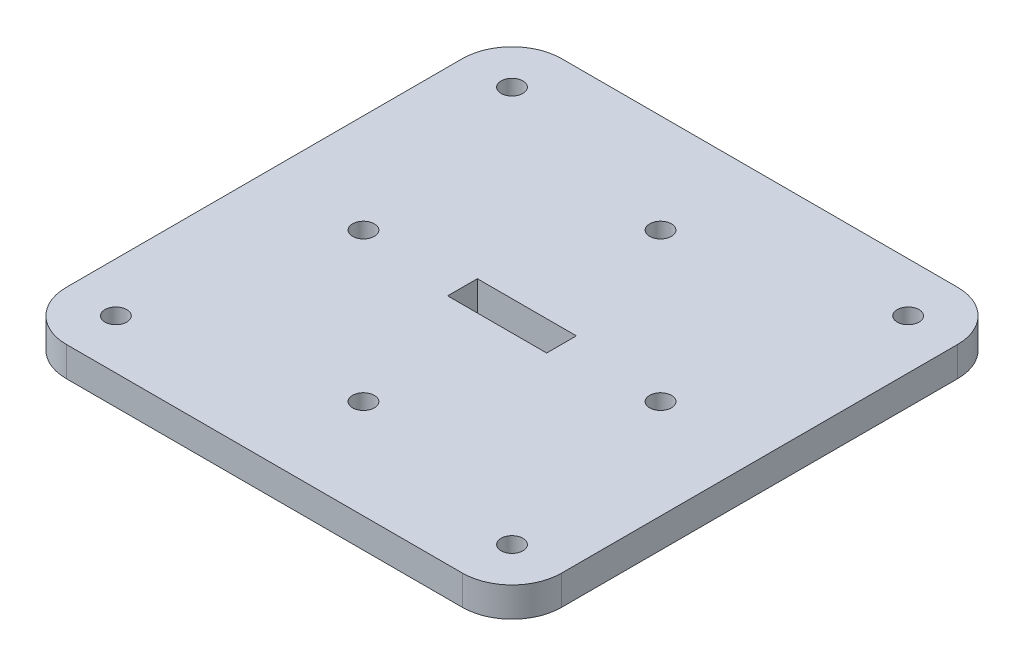
ISO-10303-21;
HEADER;
FILE_DESCRIPTION(('STEP AP214'),'2;1');
FILE_NAME('part.step','',(''),(''),'','','');
FILE_SCHEMA(('AUTOMOTIVE_DESIGN { 1 0 10303 214 1 1 1 1 }'));
ENDSEC;
DATA;
#1=APPLICATION_CONTEXT('core data for automotive mechanical design processes');
#2=APPLICATION_PROTOCOL_DEFINITION('international standard','automotive_design',2000,#1);
#3=PRODUCT_CONTEXT('',#1,'mechanical');
#4=PRODUCT('Part','Part','',(#3));
#5=PRODUCT_RELATED_PRODUCT_CATEGORY('part','',(#4));
#6=PRODUCT_DEFINITION_FORMATION('','',#4);
#7=PRODUCT_DEFINITION_CONTEXT('part definition',#1,'design');
#8=PRODUCT_DEFINITION('design','',#6,#7);
#9=PRODUCT_DEFINITION_SHAPE('','',#8);
#10=(LENGTH_UNIT() NAMED_UNIT(*) SI_UNIT(.MILLI.,.METRE.));
#11=(NAMED_UNIT(*) PLANE_ANGLE_UNIT() SI_UNIT($,.RADIAN.));
#12=(NAMED_UNIT(*) SI_UNIT($,.STERADIAN.) SOLID_ANGLE_UNIT());
#13=UNCERTAINTY_MEASURE_WITH_UNIT(LENGTH_MEASURE(1.E-05),#10,'distance_accuracy_value','');
#14=(GEOMETRIC_REPRESENTATION_CONTEXT(3) GLOBAL_UNCERTAINTY_ASSIGNED_CONTEXT((#13)) GLOBAL_UNIT_ASSIGNED_CONTEXT((#10,
#11,#12)) REPRESENTATION_CONTEXT('',''));
#15=CARTESIAN_POINT('',(0.,0.,0.));
#16=DIRECTION('',(0.,0.,1.));
#17=DIRECTION('',(1.,0.,0.));
#18=AXIS2_PLACEMENT_3D('',#15,#16,#17);
#19=CARTESIAN_POINT('',(0.,3.,0.));
#20=DIRECTION('',(0.,-1.,0.));
#21=DIRECTION('',(0.,0.,-1.));
#22=AXIS2_PLACEMENT_3D('',#19,#20,#21);
#23=PLANE('',#22);
#24=CARTESIAN_POINT('',(15.,3.,0.));
#25=DIRECTION('',(0.,1.,0.));
#26=DIRECTION('',(0.,0.,-1.));
#27=AXIS2_PLACEMENT_3D('',#24,#25,#26);
#28=CIRCLE('',#27,1.1);
#29=CARTESIAN_POINT('',(15.,3.,-1.1));
#30=VERTEX_POINT('',#29);
#31=EDGE_CURVE('E168',#30,#30,#28,.T.);
#32=ORIENTED_EDGE('',*,*,#31,.F.);
#33=EDGE_LOOP('',(#32));
#34=FACE_BOUND('',#33,.T.);
#35=CARTESIAN_POINT('',(-15.,3.,0.));
#36=DIRECTION('',(0.,1.,0.));
#37=DIRECTION('',(0.,0.,1.));
#38=AXIS2_PLACEMENT_3D('',#35,#36,#37);
#39=CIRCLE('',#38,1.1);
#40=CARTESIAN_POINT('',(-15.,3.,1.1));
#41=VERTEX_POINT('',#40);
#42=EDGE_CURVE('E174',#41,#41,#39,.T.);
#43=ORIENTED_EDGE('',*,*,#42,.F.);
#44=EDGE_LOOP('',(#43));
#45=FACE_BOUND('',#44,.T.);
#46=DIRECTION('',(0.,0.,-1.));
#47=VECTOR('',#46,1.);
#48=CARTESIAN_POINT('',(25.,3.,25.));
#49=LINE('',#48,#47);
#50=CARTESIAN_POINT('',(25.,3.,20.));
#51=VERTEX_POINT('',#50);
#52=CARTESIAN_POINT('',(25.,3.,-20.));
#53=VERTEX_POINT('',#52);
#54=EDGE_CURVE('E180',#51,#53,#49,.T.);
#55=ORIENTED_EDGE('',*,*,#54,.T.);
#56=CARTESIAN_POINT('',(20.,3.,-20.));
#57=DIRECTION('',(0.,-1.,0.));
#58=DIRECTION('',(0.,0.,-1.));
#59=AXIS2_PLACEMENT_3D('',#56,#57,#58);
#60=CIRCLE('',#59,5.);
#61=CARTESIAN_POINT('',(20.,3.,-25.));
#62=VERTEX_POINT('',#61);
#63=EDGE_CURVE('E223',#53,#62,#60,.F.);
#64=ORIENTED_EDGE('',*,*,#63,.T.);
#65=DIRECTION('',(-1.,0.,0.));
#66=VECTOR('',#65,1.);
#67=CARTESIAN_POINT('',(-25.,3.,-25.));
#68=LINE('',#67,#66);
#69=CARTESIAN_POINT('',(-20.,3.,-25.));
#70=VERTEX_POINT('',#69);
#71=EDGE_CURVE('E183',#62,#70,#68,.T.);
#72=ORIENTED_EDGE('',*,*,#71,.T.);
#73=CARTESIAN_POINT('',(-20.,3.,-20.));
#74=DIRECTION('',(0.,-1.,0.));
#75=DIRECTION('',(0.,0.,-1.));
#76=AXIS2_PLACEMENT_3D('',#73,#74,#75);
#77=CIRCLE('',#76,5.);
#78=CARTESIAN_POINT('',(-25.,3.,-20.));
#79=VERTEX_POINT('',#78);
#80=EDGE_CURVE('E221',#70,#79,#77,.F.);
#81=ORIENTED_EDGE('',*,*,#80,.T.);
#82=DIRECTION('',(0.,0.,1.));
#83=VECTOR('',#82,1.);
#84=CARTESIAN_POINT('',(-25.,3.,25.));
#85=LINE('',#84,#83);
#86=CARTESIAN_POINT('',(-25.,3.,20.));
#87=VERTEX_POINT('',#86);
#88=EDGE_CURVE('E187',#79,#87,#85,.T.);
#89=ORIENTED_EDGE('',*,*,#88,.T.);
#90=CARTESIAN_POINT('',(-20.,3.,20.));
#91=DIRECTION('',(0.,-1.,0.));
#92=DIRECTION('',(0.,0.,-1.));
#93=AXIS2_PLACEMENT_3D('',#90,#91,#92);
#94=CIRCLE('',#93,5.);
#95=CARTESIAN_POINT('',(-20.,3.,25.));
#96=VERTEX_POINT('',#95);
#97=EDGE_CURVE('E54',#87,#96,#94,.F.);
#98=ORIENTED_EDGE('',*,*,#97,.T.);
#99=DIRECTION('',(1.,0.,0.));
#100=VECTOR('',#99,1.);
#101=CARTESIAN_POINT('',(-25.,3.,25.));
#102=LINE('',#101,#100);
#103=CARTESIAN_POINT('',(20.,3.,25.));
#104=VERTEX_POINT('',#103);
#105=EDGE_CURVE('E189',#96,#104,#102,.T.);
#106=ORIENTED_EDGE('',*,*,#105,.T.);
#107=CARTESIAN_POINT('',(20.,3.,20.));
#108=DIRECTION('',(0.,-1.,0.));
#109=DIRECTION('',(0.,0.,-1.));
#110=AXIS2_PLACEMENT_3D('',#107,#108,#109);
#111=CIRCLE('',#110,5.);
#112=EDGE_CURVE('E218',#104,#51,#111,.F.);
#113=ORIENTED_EDGE('',*,*,#112,.T.);
#114=EDGE_LOOP('',(#55,#64,#72,#81,#89,#98,#106,#113));
#115=FACE_BOUND('',#114,.T.);
#116=DIRECTION('',(0.,0.,-1.));
#117=VECTOR('',#116,1.);
#118=CARTESIAN_POINT('',(5.00000000000001,3.,1.49999999999999));
#119=LINE('',#118,#117);
#120=CARTESIAN_POINT('',(5.00000000000001,3.,1.49999999999999));
#121=VERTEX_POINT('',#120);
#122=CARTESIAN_POINT('',(5.00000000000001,3.,-1.50000000000001));
#123=VERTEX_POINT('',#122);
#124=EDGE_CURVE('E124',#121,#123,#119,.T.);
#125=ORIENTED_EDGE('',*,*,#124,.F.);
#126=DIRECTION('',(1.,0.,0.));
#127=VECTOR('',#126,1.);
#128=CARTESIAN_POINT('',(-4.99999999999999,3.,1.49999999999999));
#129=LINE('',#128,#127);
#130=CARTESIAN_POINT('',(-4.99999999999999,3.,1.49999999999999));
#131=VERTEX_POINT('',#130);
#132=EDGE_CURVE('E150',#131,#121,#129,.T.);
#133=ORIENTED_EDGE('',*,*,#132,.F.);
#134=DIRECTION('',(0.,0.,1.));
#135=VECTOR('',#134,1.);
#136=CARTESIAN_POINT('',(-4.99999999999999,3.,1.49999999999999));
#137=LINE('',#136,#135);
#138=CARTESIAN_POINT('',(-4.99999999999999,3.,-1.50000000000001));
#139=VERTEX_POINT('',#138);
#140=EDGE_CURVE('E148',#139,#131,#137,.T.);
#141=ORIENTED_EDGE('',*,*,#140,.F.);
#142=DIRECTION('',(-1.,0.,0.));
#143=VECTOR('',#142,1.);
#144=CARTESIAN_POINT('',(-4.99999999999999,3.,-1.50000000000001));
#145=LINE('',#144,#143);
#146=EDGE_CURVE('E134',#123,#139,#145,.T.);
#147=ORIENTED_EDGE('',*,*,#146,.F.);
#148=EDGE_LOOP('',(#125,#133,#141,#147));
#149=FACE_BOUND('',#148,.T.);
#150=CARTESIAN_POINT('',(-20.,3.,-20.));
#151=DIRECTION('',(0.,1.,0.));
#152=DIRECTION('',(0.,0.,1.));
#153=AXIS2_PLACEMENT_3D('',#150,#151,#152);
#154=CIRCLE('',#153,1.1);
#155=CARTESIAN_POINT('',(-20.,3.,-18.9));
#156=VERTEX_POINT('',#155);
#157=EDGE_CURVE('E157',#156,#156,#154,.T.);
#158=ORIENTED_EDGE('',*,*,#157,.F.);
#159=EDGE_LOOP('',(#158));
#160=FACE_BOUND('',#159,.T.);
#161=CARTESIAN_POINT('',(20.,3.,-20.));
#162=DIRECTION('',(0.,1.,0.));
#163=DIRECTION('',(0.,0.,-1.));
#164=AXIS2_PLACEMENT_3D('',#161,#162,#163);
#165=CIRCLE('',#164,1.1);
#166=CARTESIAN_POINT('',(20.,3.,-21.1));
#167=VERTEX_POINT('',#166);
#168=EDGE_CURVE('E491',#167,#167,#165,.T.);
#169=ORIENTED_EDGE('',*,*,#168,.F.);
#170=EDGE_LOOP('',(#169));
#171=FACE_BOUND('',#170,.T.);
#172=CARTESIAN_POINT('',(20.,3.,20.));
#173=DIRECTION('',(0.,1.,0.));
#174=DIRECTION('',(0.,0.,1.));
#175=AXIS2_PLACEMENT_3D('',#172,#173,#174);
#176=CIRCLE('',#175,1.1);
#177=CARTESIAN_POINT('',(20.,3.,21.1));
#178=VERTEX_POINT('',#177);
#179=EDGE_CURVE('E485',#178,#178,#176,.T.);
#180=ORIENTED_EDGE('',*,*,#179,.F.);
#181=EDGE_LOOP('',(#180));
#182=FACE_BOUND('',#181,.T.);
#183=CARTESIAN_POINT('',(-20.,3.,20.));
#184=DIRECTION('',(0.,1.,0.));
#185=DIRECTION('',(0.,0.,-1.));
#186=AXIS2_PLACEMENT_3D('',#183,#184,#185);
#187=CIRCLE('',#186,1.1);
#188=CARTESIAN_POINT('',(-20.,3.,18.9));
#189=VERTEX_POINT('',#188);
#190=EDGE_CURVE('E479',#189,#189,#187,.T.);
#191=ORIENTED_EDGE('',*,*,#190,.F.);
#192=EDGE_LOOP('',(#191));
#193=FACE_BOUND('',#192,.T.);
#194=CARTESIAN_POINT('',(0.,3.,-15.));
#195=DIRECTION('',(0.,1.,0.));
#196=DIRECTION('',(0.,0.,1.));
#197=AXIS2_PLACEMENT_3D('',#194,#195,#196);
#198=CIRCLE('',#197,1.1);
#199=CARTESIAN_POINT('',(0.,3.,-13.9));
#200=VERTEX_POINT('',#199);
#201=EDGE_CURVE('E473',#200,#200,#198,.T.);
#202=ORIENTED_EDGE('',*,*,#201,.F.);
#203=EDGE_LOOP('',(#202));
#204=FACE_BOUND('',#203,.T.);
#205=CARTESIAN_POINT('',(0.,3.,15.));
#206=DIRECTION('',(0.,1.,0.));
#207=DIRECTION('',(0.,0.,-1.));
#208=AXIS2_PLACEMENT_3D('',#205,#206,#207);
#209=CIRCLE('',#208,1.1);
#210=CARTESIAN_POINT('',(0.,3.,13.9));
#211=VERTEX_POINT('',#210);
#212=EDGE_CURVE('E464',#211,#211,#209,.T.);
#213=ORIENTED_EDGE('',*,*,#212,.F.);
#214=EDGE_LOOP('',(#213));
#215=FACE_BOUND('',#214,.T.);
#216=ADVANCED_FACE('F33',(#34,#45,#115,#149,#160,#171,#182,#193,#204,#215),#23,.F.);
#217=CARTESIAN_POINT('',(0.,0.,0.));
#218=DIRECTION('',(0.,-1.,0.));
#219=DIRECTION('',(0.,0.,-1.));
#220=AXIS2_PLACEMENT_3D('',#217,#218,#219);
#221=PLANE('',#220);
#222=CARTESIAN_POINT('',(0.,0.,-15.));
#223=DIRECTION('',(0.,1.,0.));
#224=DIRECTION('',(0.,0.,1.));
#225=AXIS2_PLACEMENT_3D('',#222,#223,#224);
#226=CIRCLE('',#225,1.1);
#227=CARTESIAN_POINT('',(0.,0.,-13.9));
#228=VERTEX_POINT('',#227);
#229=EDGE_CURVE('E470',#228,#228,#226,.T.);
#230=ORIENTED_EDGE('',*,*,#229,.T.);
#231=EDGE_LOOP('',(#230));
#232=FACE_BOUND('',#231,.T.);
#233=CARTESIAN_POINT('',(20.,0.,20.));
#234=DIRECTION('',(0.,1.,0.));
#235=DIRECTION('',(0.,0.,1.));
#236=AXIS2_PLACEMENT_3D('',#233,#234,#235);
#237=CIRCLE('',#236,1.1);
#238=CARTESIAN_POINT('',(20.,0.,21.1));
#239=VERTEX_POINT('',#238);
#240=EDGE_CURVE('E482',#239,#239,#237,.T.);
#241=ORIENTED_EDGE('',*,*,#240,.T.);
#242=EDGE_LOOP('',(#241));
#243=FACE_BOUND('',#242,.T.);
#244=CARTESIAN_POINT('',(-20.,0.,-20.));
#245=DIRECTION('',(0.,1.,0.));
#246=DIRECTION('',(0.,0.,1.));
#247=AXIS2_PLACEMENT_3D('',#244,#245,#246);
#248=CIRCLE('',#247,1.1);
#249=CARTESIAN_POINT('',(-20.,0.,-18.9));
#250=VERTEX_POINT('',#249);
#251=EDGE_CURVE('E494',#250,#250,#248,.T.);
#252=ORIENTED_EDGE('',*,*,#251,.T.);
#253=EDGE_LOOP('',(#252));
#254=FACE_BOUND('',#253,.T.);
#255=CARTESIAN_POINT('',(-15.,0.,0.));
#256=DIRECTION('',(0.,1.,0.));
#257=DIRECTION('',(0.,0.,1.));
#258=AXIS2_PLACEMENT_3D('',#255,#256,#257);
#259=CIRCLE('',#258,1.1);
#260=CARTESIAN_POINT('',(-15.,0.,1.1));
#261=VERTEX_POINT('',#260);
#262=EDGE_CURVE('E171',#261,#261,#259,.T.);
#263=ORIENTED_EDGE('',*,*,#262,.T.);
#264=EDGE_LOOP('',(#263));
#265=FACE_BOUND('',#264,.T.);
#266=DIRECTION('',(-1.,0.,0.));
#267=VECTOR('',#266,1.);
#268=CARTESIAN_POINT('',(-25.,0.,-25.));
#269=LINE('',#268,#267);
#270=CARTESIAN_POINT('',(20.,0.,-25.));
#271=VERTEX_POINT('',#270);
#272=CARTESIAN_POINT('',(-20.,0.,-25.));
#273=VERTEX_POINT('',#272);
#274=EDGE_CURVE('E194',#271,#273,#269,.T.);
#275=ORIENTED_EDGE('',*,*,#274,.F.);
#276=CARTESIAN_POINT('',(20.,0.,-20.));
#277=DIRECTION('',(0.,-1.,0.));
#278=DIRECTION('',(0.,0.,-1.));
#279=AXIS2_PLACEMENT_3D('',#276,#277,#278);
#280=CIRCLE('',#279,5.);
#281=CARTESIAN_POINT('',(25.,0.,-20.));
#282=VERTEX_POINT('',#281);
#283=EDGE_CURVE('E211',#271,#282,#280,.T.);
#284=ORIENTED_EDGE('',*,*,#283,.T.);
#285=DIRECTION('',(0.,0.,-1.));
#286=VECTOR('',#285,1.);
#287=CARTESIAN_POINT('',(25.,0.,25.));
#288=LINE('',#287,#286);
#289=CARTESIAN_POINT('',(25.,0.,20.));
#290=VERTEX_POINT('',#289);
#291=EDGE_CURVE('E177',#290,#282,#288,.T.);
#292=ORIENTED_EDGE('',*,*,#291,.F.);
#293=CARTESIAN_POINT('',(20.,0.,20.));
#294=DIRECTION('',(0.,-1.,0.));
#295=DIRECTION('',(0.,0.,-1.));
#296=AXIS2_PLACEMENT_3D('',#293,#294,#295);
#297=CIRCLE('',#296,5.);
#298=CARTESIAN_POINT('',(20.,0.,25.));
#299=VERTEX_POINT('',#298);
#300=EDGE_CURVE('E205',#290,#299,#297,.T.);
#301=ORIENTED_EDGE('',*,*,#300,.T.);
#302=DIRECTION('',(1.,0.,0.));
#303=VECTOR('',#302,1.);
#304=CARTESIAN_POINT('',(-25.,0.,25.));
#305=LINE('',#304,#303);
#306=CARTESIAN_POINT('',(-20.,0.,25.));
#307=VERTEX_POINT('',#306);
#308=EDGE_CURVE('E184',#307,#299,#305,.T.);
#309=ORIENTED_EDGE('',*,*,#308,.F.);
#310=CARTESIAN_POINT('',(-20.,0.,20.));
#311=DIRECTION('',(0.,-1.,0.));
#312=DIRECTION('',(0.,0.,-1.));
#313=AXIS2_PLACEMENT_3D('',#310,#311,#312);
#314=CIRCLE('',#313,5.);
#315=CARTESIAN_POINT('',(-25.,0.,20.));
#316=VERTEX_POINT('',#315);
#317=EDGE_CURVE('E207',#307,#316,#314,.T.);
#318=ORIENTED_EDGE('',*,*,#317,.T.);
#319=DIRECTION('',(0.,0.,1.));
#320=VECTOR('',#319,1.);
#321=CARTESIAN_POINT('',(-25.,0.,25.));
#322=LINE('',#321,#320);
#323=CARTESIAN_POINT('',(-25.,0.,-20.));
#324=VERTEX_POINT('',#323);
#325=EDGE_CURVE('E197',#324,#316,#322,.T.);
#326=ORIENTED_EDGE('',*,*,#325,.F.);
#327=CARTESIAN_POINT('',(-20.,0.,-20.));
#328=DIRECTION('',(0.,-1.,0.));
#329=DIRECTION('',(0.,0.,-1.));
#330=AXIS2_PLACEMENT_3D('',#327,#328,#329);
#331=CIRCLE('',#330,5.);
#332=EDGE_CURVE('E209',#324,#273,#331,.T.);
#333=ORIENTED_EDGE('',*,*,#332,.T.);
#334=EDGE_LOOP('',(#275,#284,#292,#301,#309,#318,#326,#333));
#335=FACE_BOUND('',#334,.T.);
#336=CARTESIAN_POINT('',(15.,0.,0.));
#337=DIRECTION('',(0.,1.,0.));
#338=DIRECTION('',(0.,0.,-1.));
#339=AXIS2_PLACEMENT_3D('',#336,#337,#338);
#340=CIRCLE('',#339,1.1);
#341=CARTESIAN_POINT('',(15.,0.,-1.1));
#342=VERTEX_POINT('',#341);
#343=EDGE_CURVE('E142',#342,#342,#340,.T.);
#344=ORIENTED_EDGE('',*,*,#343,.T.);
#345=EDGE_LOOP('',(#344));
#346=FACE_BOUND('',#345,.T.);
#347=DIRECTION('',(1.,0.,0.));
#348=VECTOR('',#347,1.);
#349=CARTESIAN_POINT('',(-4.99999999999999,0.,1.49999999999999));
#350=LINE('',#349,#348);
#351=CARTESIAN_POINT('',(-4.99999999999999,0.,1.49999999999999));
#352=VERTEX_POINT('',#351);
#353=CARTESIAN_POINT('',(5.00000000000001,0.,1.49999999999999));
#354=VERTEX_POINT('',#353);
#355=EDGE_CURVE('E135',#352,#354,#350,.T.);
#356=ORIENTED_EDGE('',*,*,#355,.T.);
#357=DIRECTION('',(0.,0.,-1.));
#358=VECTOR('',#357,1.);
#359=CARTESIAN_POINT('',(5.00000000000001,0.,1.49999999999999));
#360=LINE('',#359,#358);
#361=CARTESIAN_POINT('',(5.00000000000001,0.,-1.50000000000001));
#362=VERTEX_POINT('',#361);
#363=EDGE_CURVE('E155',#354,#362,#360,.T.);
#364=ORIENTED_EDGE('',*,*,#363,.T.);
#365=DIRECTION('',(-1.,0.,0.));
#366=VECTOR('',#365,1.);
#367=CARTESIAN_POINT('',(-4.99999999999999,0.,-1.50000000000001));
#368=LINE('',#367,#366);
#369=CARTESIAN_POINT('',(-4.99999999999999,0.,-1.50000000000001));
#370=VERTEX_POINT('',#369);
#371=EDGE_CURVE('E141',#362,#370,#368,.T.);
#372=ORIENTED_EDGE('',*,*,#371,.T.);
#373=DIRECTION('',(0.,0.,1.));
#374=VECTOR('',#373,1.);
#375=CARTESIAN_POINT('',(-4.99999999999999,0.,1.49999999999999));
#376=LINE('',#375,#374);
#377=EDGE_CURVE('E159',#370,#352,#376,.T.);
#378=ORIENTED_EDGE('',*,*,#377,.T.);
#379=EDGE_LOOP('',(#356,#364,#372,#378));
#380=FACE_BOUND('',#379,.T.);
#381=CARTESIAN_POINT('',(20.,0.,-20.));
#382=DIRECTION('',(0.,1.,0.));
#383=DIRECTION('',(0.,0.,-1.));
#384=AXIS2_PLACEMENT_3D('',#381,#382,#383);
#385=CIRCLE('',#384,1.1);
#386=CARTESIAN_POINT('',(20.,0.,-21.1));
#387=VERTEX_POINT('',#386);
#388=EDGE_CURVE('E488',#387,#387,#385,.T.);
#389=ORIENTED_EDGE('',*,*,#388,.T.);
#390=EDGE_LOOP('',(#389));
#391=FACE_BOUND('',#390,.T.);
#392=CARTESIAN_POINT('',(-20.,0.,20.));
#393=DIRECTION('',(0.,1.,0.));
#394=DIRECTION('',(0.,0.,-1.));
#395=AXIS2_PLACEMENT_3D('',#392,#393,#394);
#396=CIRCLE('',#395,1.1);
#397=CARTESIAN_POINT('',(-20.,0.,18.9));
#398=VERTEX_POINT('',#397);
#399=EDGE_CURVE('E476',#398,#398,#396,.T.);
#400=ORIENTED_EDGE('',*,*,#399,.T.);
#401=EDGE_LOOP('',(#400));
#402=FACE_BOUND('',#401,.T.);
#403=CARTESIAN_POINT('',(0.,0.,15.));
#404=DIRECTION('',(0.,1.,0.));
#405=DIRECTION('',(0.,0.,-1.));
#406=AXIS2_PLACEMENT_3D('',#403,#404,#405);
#407=CIRCLE('',#406,1.1);
#408=CARTESIAN_POINT('',(0.,0.,13.9));
#409=VERTEX_POINT('',#408);
#410=EDGE_CURVE('E467',#409,#409,#407,.T.);
#411=ORIENTED_EDGE('',*,*,#410,.T.);
#412=EDGE_LOOP('',(#411));
#413=FACE_BOUND('',#412,.T.);
#414=ADVANCED_FACE('F239',(#232,#243,#254,#265,#335,#346,#380,#391,#402,#413),#221,.T.);
#415=CARTESIAN_POINT('',(25.,3.,25.));
#416=DIRECTION('',(-1.,0.,0.));
#417=DIRECTION('',(0.,0.,1.));
#418=AXIS2_PLACEMENT_3D('',#415,#416,#417);
#419=PLANE('',#418);
#420=ORIENTED_EDGE('',*,*,#291,.T.);
#421=DIRECTION('',(0.,-1.,0.));
#422=VECTOR('',#421,1.);
#423=CARTESIAN_POINT('',(25.,3.,-20.));
#424=LINE('',#423,#422);
#425=EDGE_CURVE('E216',#282,#53,#424,.F.);
#426=ORIENTED_EDGE('',*,*,#425,.T.);
#427=ORIENTED_EDGE('',*,*,#54,.F.);
#428=DIRECTION('',(0.,-1.,0.));
#429=VECTOR('',#428,1.);
#430=CARTESIAN_POINT('',(25.,3.,20.));
#431=LINE('',#430,#429);
#432=EDGE_CURVE('E213',#51,#290,#431,.T.);
#433=ORIENTED_EDGE('',*,*,#432,.T.);
#434=EDGE_LOOP('',(#420,#426,#427,#433));
#435=FACE_BOUND('',#434,.T.);
#436=ADVANCED_FACE('F252',(#435),#419,.F.);
#437=CARTESIAN_POINT('',(-25.,3.,-25.));
#438=DIRECTION('',(0.,0.,1.));
#439=DIRECTION('',(1.,0.,0.));
#440=AXIS2_PLACEMENT_3D('',#437,#438,#439);
#441=PLANE('',#440);
#442=ORIENTED_EDGE('',*,*,#71,.F.);
#443=DIRECTION('',(0.,-1.,0.));
#444=VECTOR('',#443,1.);
#445=CARTESIAN_POINT('',(20.,3.,-25.));
#446=LINE('',#445,#444);
#447=EDGE_CURVE('E202',#62,#271,#446,.T.);
#448=ORIENTED_EDGE('',*,*,#447,.T.);
#449=ORIENTED_EDGE('',*,*,#274,.T.);
#450=DIRECTION('',(0.,-1.,0.));
#451=VECTOR('',#450,1.);
#452=CARTESIAN_POINT('',(-20.,3.,-25.));
#453=LINE('',#452,#451);
#454=EDGE_CURVE('E191',#273,#70,#453,.F.);
#455=ORIENTED_EDGE('',*,*,#454,.T.);
#456=EDGE_LOOP('',(#442,#448,#449,#455));
#457=FACE_BOUND('',#456,.T.);
#458=ADVANCED_FACE('F260',(#457),#441,.F.);
#459=CARTESIAN_POINT('',(-25.,3.,25.));
#460=DIRECTION('',(1.,0.,0.));
#461=DIRECTION('',(0.,0.,-1.));
#462=AXIS2_PLACEMENT_3D('',#459,#460,#461);
#463=PLANE('',#462);
#464=ORIENTED_EDGE('',*,*,#88,.F.);
#465=DIRECTION('',(0.,-1.,0.));
#466=VECTOR('',#465,1.);
#467=CARTESIAN_POINT('',(-25.,3.,-20.));
#468=LINE('',#467,#466);
#469=EDGE_CURVE('E227',#79,#324,#468,.T.);
#470=ORIENTED_EDGE('',*,*,#469,.T.);
#471=ORIENTED_EDGE('',*,*,#325,.T.);
#472=DIRECTION('',(0.,-1.,0.));
#473=VECTOR('',#472,1.);
#474=CARTESIAN_POINT('',(-25.,3.,20.));
#475=LINE('',#474,#473);
#476=EDGE_CURVE('E225',#316,#87,#475,.F.);
#477=ORIENTED_EDGE('',*,*,#476,.T.);
#478=EDGE_LOOP('',(#464,#470,#471,#477));
#479=FACE_BOUND('',#478,.T.);
#480=ADVANCED_FACE('F233',(#479),#463,.F.);
#481=CARTESIAN_POINT('',(-25.,3.,25.));
#482=DIRECTION('',(0.,0.,-1.));
#483=DIRECTION('',(-1.,0.,0.));
#484=AXIS2_PLACEMENT_3D('',#481,#482,#483);
#485=PLANE('',#484);
#486=ORIENTED_EDGE('',*,*,#105,.F.);
#487=DIRECTION('',(0.,-1.,0.));
#488=VECTOR('',#487,1.);
#489=CARTESIAN_POINT('',(-20.,3.,25.));
#490=LINE('',#489,#488);
#491=EDGE_CURVE('E11',#96,#307,#490,.T.);
#492=ORIENTED_EDGE('',*,*,#491,.T.);
#493=ORIENTED_EDGE('',*,*,#308,.T.);
#494=DIRECTION('',(0.,-1.,0.));
#495=VECTOR('',#494,1.);
#496=CARTESIAN_POINT('',(20.,3.,25.));
#497=LINE('',#496,#495);
#498=EDGE_CURVE('E41',#299,#104,#497,.F.);
#499=ORIENTED_EDGE('',*,*,#498,.T.);
#500=EDGE_LOOP('',(#486,#492,#493,#499));
#501=FACE_BOUND('',#500,.T.);
#502=ADVANCED_FACE('F245',(#501),#485,.F.);
#503=CARTESIAN_POINT('',(-15.,3.,0.));
#504=DIRECTION('',(0.,-1.,0.));
#505=DIRECTION('',(0.,0.,-1.));
#506=AXIS2_PLACEMENT_3D('',#503,#504,#505);
#507=CYLINDRICAL_SURFACE('',#506,1.1);
#508=ORIENTED_EDGE('',*,*,#42,.T.);
#509=EDGE_LOOP('',(#508));
#510=FACE_BOUND('',#509,.T.);
#511=ORIENTED_EDGE('',*,*,#262,.F.);
#512=EDGE_LOOP('',(#511));
#513=FACE_BOUND('',#512,.T.);
#514=ADVANCED_FACE('F282',(#510,#513),#507,.F.);
#515=CARTESIAN_POINT('',(15.,3.,0.));
#516=DIRECTION('',(0.,-1.,0.));
#517=DIRECTION('',(0.,0.,-1.));
#518=AXIS2_PLACEMENT_3D('',#515,#516,#517);
#519=CYLINDRICAL_SURFACE('',#518,1.1);
#520=ORIENTED_EDGE('',*,*,#31,.T.);
#521=EDGE_LOOP('',(#520));
#522=FACE_BOUND('',#521,.T.);
#523=ORIENTED_EDGE('',*,*,#343,.F.);
#524=EDGE_LOOP('',(#523));
#525=FACE_BOUND('',#524,.T.);
#526=ADVANCED_FACE('F315',(#522,#525),#519,.F.);
#527=CARTESIAN_POINT('',(5.00000000000001,3.,1.49999999999999));
#528=DIRECTION('',(-1.,0.,0.));
#529=DIRECTION('',(0.,0.,1.));
#530=AXIS2_PLACEMENT_3D('',#527,#528,#529);
#531=PLANE('',#530);
#532=ORIENTED_EDGE('',*,*,#363,.F.);
#533=DIRECTION('',(0.,-1.,0.));
#534=VECTOR('',#533,1.);
#535=CARTESIAN_POINT('',(5.00000000000001,3.,1.49999999999999));
#536=LINE('',#535,#534);
#537=EDGE_CURVE('E130',#121,#354,#536,.T.);
#538=ORIENTED_EDGE('',*,*,#537,.F.);
#539=ORIENTED_EDGE('',*,*,#124,.T.);
#540=DIRECTION('',(0.,-1.,0.));
#541=VECTOR('',#540,1.);
#542=CARTESIAN_POINT('',(5.00000000000001,3.,-1.50000000000001));
#543=LINE('',#542,#541);
#544=EDGE_CURVE('E127',#123,#362,#543,.T.);
#545=ORIENTED_EDGE('',*,*,#544,.T.);
#546=EDGE_LOOP('',(#532,#538,#539,#545));
#547=FACE_BOUND('',#546,.T.);
#548=ADVANCED_FACE('F126',(#547),#531,.T.);
#549=CARTESIAN_POINT('',(-4.99999999999999,3.,-1.50000000000001));
#550=DIRECTION('',(0.,0.,1.));
#551=DIRECTION('',(1.,0.,0.));
#552=AXIS2_PLACEMENT_3D('',#549,#550,#551);
#553=PLANE('',#552);
#554=ORIENTED_EDGE('',*,*,#371,.F.);
#555=ORIENTED_EDGE('',*,*,#544,.F.);
#556=ORIENTED_EDGE('',*,*,#146,.T.);
#557=DIRECTION('',(0.,-1.,0.));
#558=VECTOR('',#557,1.);
#559=CARTESIAN_POINT('',(-4.99999999999999,3.,-1.50000000000001));
#560=LINE('',#559,#558);
#561=EDGE_CURVE('E143',#139,#370,#560,.T.);
#562=ORIENTED_EDGE('',*,*,#561,.T.);
#563=EDGE_LOOP('',(#554,#555,#556,#562));
#564=FACE_BOUND('',#563,.T.);
#565=ADVANCED_FACE('F138',(#564),#553,.T.);
#566=CARTESIAN_POINT('',(-4.99999999999999,3.,1.49999999999999));
#567=DIRECTION('',(1.,0.,0.));
#568=DIRECTION('',(0.,0.,-1.));
#569=AXIS2_PLACEMENT_3D('',#566,#567,#568);
#570=PLANE('',#569);
#571=ORIENTED_EDGE('',*,*,#377,.F.);
#572=ORIENTED_EDGE('',*,*,#561,.F.);
#573=ORIENTED_EDGE('',*,*,#140,.T.);
#574=DIRECTION('',(0.,-1.,0.));
#575=VECTOR('',#574,1.);
#576=CARTESIAN_POINT('',(-4.99999999999999,3.,1.49999999999999));
#577=LINE('',#576,#575);
#578=EDGE_CURVE('E165',#131,#352,#577,.T.);
#579=ORIENTED_EDGE('',*,*,#578,.T.);
#580=EDGE_LOOP('',(#571,#572,#573,#579));
#581=FACE_BOUND('',#580,.T.);
#582=ADVANCED_FACE('F334',(#581),#570,.T.);
#583=CARTESIAN_POINT('',(-4.99999999999999,3.,1.49999999999999));
#584=DIRECTION('',(0.,0.,-1.));
#585=DIRECTION('',(-1.,0.,0.));
#586=AXIS2_PLACEMENT_3D('',#583,#584,#585);
#587=PLANE('',#586);
#588=ORIENTED_EDGE('',*,*,#355,.F.);
#589=ORIENTED_EDGE('',*,*,#578,.F.);
#590=ORIENTED_EDGE('',*,*,#132,.T.);
#591=ORIENTED_EDGE('',*,*,#537,.T.);
#592=EDGE_LOOP('',(#588,#589,#590,#591));
#593=FACE_BOUND('',#592,.T.);
#594=ADVANCED_FACE('F341',(#593),#587,.T.);
#595=CARTESIAN_POINT('',(-20.,3.,-20.));
#596=DIRECTION('',(0.,-1.,0.));
#597=DIRECTION('',(0.,0.,-1.));
#598=AXIS2_PLACEMENT_3D('',#595,#596,#597);
#599=CYLINDRICAL_SURFACE('',#598,1.1);
#600=ORIENTED_EDGE('',*,*,#157,.T.);
#601=EDGE_LOOP('',(#600));
#602=FACE_BOUND('',#601,.T.);
#603=ORIENTED_EDGE('',*,*,#251,.F.);
#604=EDGE_LOOP('',(#603));
#605=FACE_BOUND('',#604,.T.);
#606=ADVANCED_FACE('F349',(#602,#605),#599,.F.);
#607=CARTESIAN_POINT('',(20.,3.,-20.));
#608=DIRECTION('',(0.,-1.,0.));
#609=DIRECTION('',(0.,0.,-1.));
#610=AXIS2_PLACEMENT_3D('',#607,#608,#609);
#611=CYLINDRICAL_SURFACE('',#610,1.1);
#612=ORIENTED_EDGE('',*,*,#168,.T.);
#613=EDGE_LOOP('',(#612));
#614=FACE_BOUND('',#613,.T.);
#615=ORIENTED_EDGE('',*,*,#388,.F.);
#616=EDGE_LOOP('',(#615));
#617=FACE_BOUND('',#616,.T.);
#618=ADVANCED_FACE('F357',(#614,#617),#611,.F.);
#619=CARTESIAN_POINT('',(20.,3.,20.));
#620=DIRECTION('',(0.,-1.,0.));
#621=DIRECTION('',(0.,0.,-1.));
#622=AXIS2_PLACEMENT_3D('',#619,#620,#621);
#623=CYLINDRICAL_SURFACE('',#622,1.1);
#624=ORIENTED_EDGE('',*,*,#179,.T.);
#625=EDGE_LOOP('',(#624));
#626=FACE_BOUND('',#625,.T.);
#627=ORIENTED_EDGE('',*,*,#240,.F.);
#628=EDGE_LOOP('',(#627));
#629=FACE_BOUND('',#628,.T.);
#630=ADVANCED_FACE('F365',(#626,#629),#623,.F.);
#631=CARTESIAN_POINT('',(-20.,3.,20.));
#632=DIRECTION('',(0.,-1.,0.));
#633=DIRECTION('',(0.,0.,-1.));
#634=AXIS2_PLACEMENT_3D('',#631,#632,#633);
#635=CYLINDRICAL_SURFACE('',#634,1.1);
#636=ORIENTED_EDGE('',*,*,#190,.T.);
#637=EDGE_LOOP('',(#636));
#638=FACE_BOUND('',#637,.T.);
#639=ORIENTED_EDGE('',*,*,#399,.F.);
#640=EDGE_LOOP('',(#639));
#641=FACE_BOUND('',#640,.T.);
#642=ADVANCED_FACE('F373',(#638,#641),#635,.F.);
#643=CARTESIAN_POINT('',(0.,3.,-15.));
#644=DIRECTION('',(0.,-1.,0.));
#645=DIRECTION('',(0.,0.,-1.));
#646=AXIS2_PLACEMENT_3D('',#643,#644,#645);
#647=CYLINDRICAL_SURFACE('',#646,1.1);
#648=ORIENTED_EDGE('',*,*,#201,.T.);
#649=EDGE_LOOP('',(#648));
#650=FACE_BOUND('',#649,.T.);
#651=ORIENTED_EDGE('',*,*,#229,.F.);
#652=EDGE_LOOP('',(#651));
#653=FACE_BOUND('',#652,.T.);
#654=ADVANCED_FACE('F381',(#650,#653),#647,.F.);
#655=CARTESIAN_POINT('',(0.,3.,15.));
#656=DIRECTION('',(0.,-1.,0.));
#657=DIRECTION('',(0.,0.,-1.));
#658=AXIS2_PLACEMENT_3D('',#655,#656,#657);
#659=CYLINDRICAL_SURFACE('',#658,1.1);
#660=ORIENTED_EDGE('',*,*,#212,.T.);
#661=EDGE_LOOP('',(#660));
#662=FACE_BOUND('',#661,.T.);
#663=ORIENTED_EDGE('',*,*,#410,.F.);
#664=EDGE_LOOP('',(#663));
#665=FACE_BOUND('',#664,.T.);
#666=ADVANCED_FACE('F269',(#662,#665),#659,.F.);
#667=CARTESIAN_POINT('',(20.,3.,-20.));
#668=DIRECTION('',(0.,-1.,0.));
#669=DIRECTION('',(0.,0.,-1.));
#670=AXIS2_PLACEMENT_3D('',#667,#668,#669);
#671=CYLINDRICAL_SURFACE('',#670,5.);
#672=ORIENTED_EDGE('',*,*,#63,.F.);
#673=ORIENTED_EDGE('',*,*,#425,.F.);
#674=ORIENTED_EDGE('',*,*,#283,.F.);
#675=ORIENTED_EDGE('',*,*,#447,.F.);
#676=EDGE_LOOP('',(#672,#673,#674,#675));
#677=FACE_BOUND('',#676,.T.);
#678=ADVANCED_FACE('F257',(#677),#671,.T.);
#679=CARTESIAN_POINT('',(-20.,3.,-20.));
#680=DIRECTION('',(0.,-1.,0.));
#681=DIRECTION('',(0.,0.,-1.));
#682=AXIS2_PLACEMENT_3D('',#679,#680,#681);
#683=CYLINDRICAL_SURFACE('',#682,5.);
#684=ORIENTED_EDGE('',*,*,#80,.F.);
#685=ORIENTED_EDGE('',*,*,#454,.F.);
#686=ORIENTED_EDGE('',*,*,#332,.F.);
#687=ORIENTED_EDGE('',*,*,#469,.F.);
#688=EDGE_LOOP('',(#684,#685,#686,#687));
#689=FACE_BOUND('',#688,.T.);
#690=ADVANCED_FACE('F262',(#689),#683,.T.);
#691=CARTESIAN_POINT('',(-20.,3.,20.));
#692=DIRECTION('',(0.,-1.,0.));
#693=DIRECTION('',(0.,0.,-1.));
#694=AXIS2_PLACEMENT_3D('',#691,#692,#693);
#695=CYLINDRICAL_SURFACE('',#694,5.);
#696=ORIENTED_EDGE('',*,*,#97,.F.);
#697=ORIENTED_EDGE('',*,*,#476,.F.);
#698=ORIENTED_EDGE('',*,*,#317,.F.);
#699=ORIENTED_EDGE('',*,*,#491,.F.);
#700=EDGE_LOOP('',(#696,#697,#698,#699));
#701=FACE_BOUND('',#700,.T.);
#702=ADVANCED_FACE('F244',(#701),#695,.T.);
#703=CARTESIAN_POINT('',(20.,3.,20.));
#704=DIRECTION('',(0.,-1.,0.));
#705=DIRECTION('',(0.,0.,-1.));
#706=AXIS2_PLACEMENT_3D('',#703,#704,#705);
#707=CYLINDRICAL_SURFACE('',#706,5.);
#708=ORIENTED_EDGE('',*,*,#112,.F.);
#709=ORIENTED_EDGE('',*,*,#498,.F.);
#710=ORIENTED_EDGE('',*,*,#300,.F.);
#711=ORIENTED_EDGE('',*,*,#432,.F.);
#712=EDGE_LOOP('',(#708,#709,#710,#711));
#713=FACE_BOUND('',#712,.T.);
#714=ADVANCED_FACE('F35',(#713),#707,.T.);
#715=CLOSED_SHELL('',(#216,#414,#436,#458,#480,#502,#514,#526,#548,#565,#582,#594,#606,#618,
#630,#642,#654,#666,#678,#690,#702,#714));
#716=MANIFOLD_SOLID_BREP('B2',#715);
#717=ADVANCED_BREP_SHAPE_REPRESENTATION('',(#18,#716),#14);
#718=SHAPE_DEFINITION_REPRESENTATION(#9,#717);
ENDSEC;
END-ISO-10303-21;
